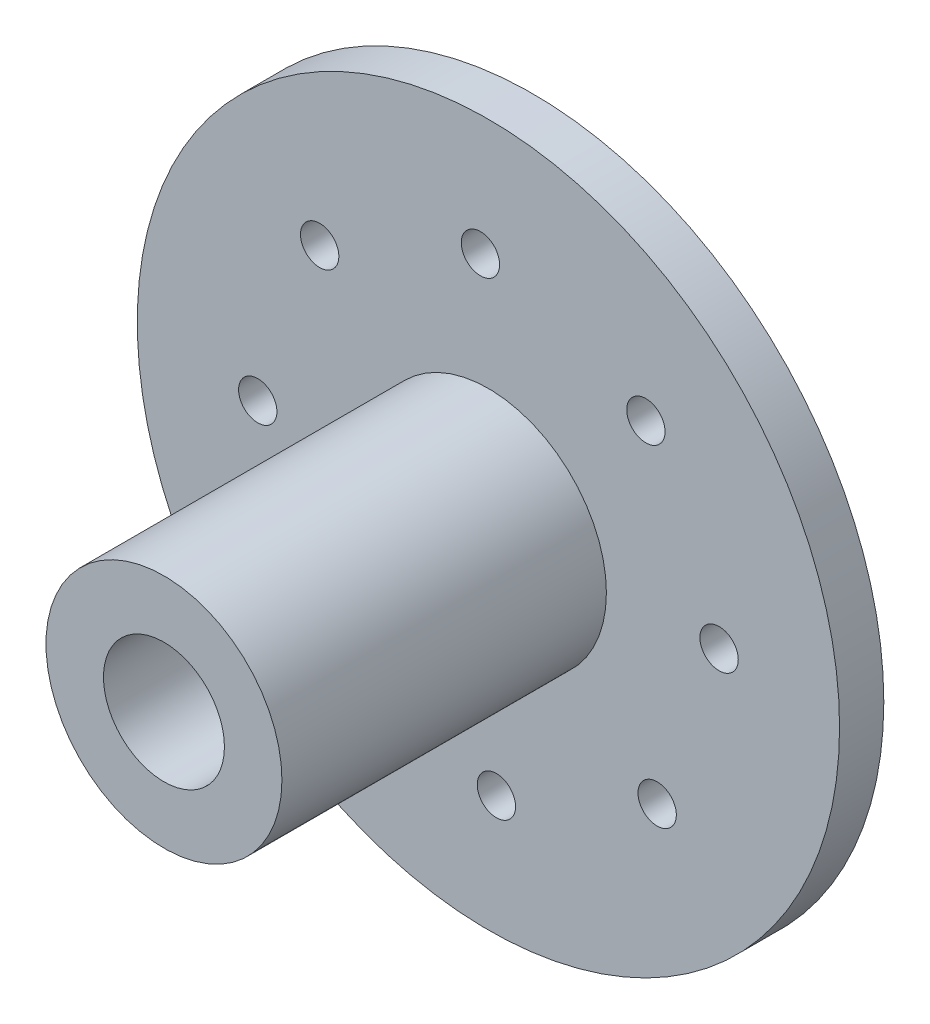
ISO-10303-21;
HEADER;
FILE_DESCRIPTION(('STEP AP214'),'2;1');
FILE_NAME('part.step','',(''),(''),'','','');
FILE_SCHEMA(('AUTOMOTIVE_DESIGN { 1 0 10303 214 1 1 1 1 }'));
ENDSEC;
DATA;
#1=APPLICATION_CONTEXT('core data for automotive mechanical design processes');
#2=APPLICATION_PROTOCOL_DEFINITION('international standard','automotive_design',2000,#1);
#3=PRODUCT_CONTEXT('',#1,'mechanical');
#4=PRODUCT('Part','Part','',(#3));
#5=PRODUCT_RELATED_PRODUCT_CATEGORY('part','',(#4));
#6=PRODUCT_DEFINITION_FORMATION('','',#4);
#7=PRODUCT_DEFINITION_CONTEXT('part definition',#1,'design');
#8=PRODUCT_DEFINITION('design','',#6,#7);
#9=PRODUCT_DEFINITION_SHAPE('','',#8);
#10=(LENGTH_UNIT() NAMED_UNIT(*) SI_UNIT(.MILLI.,.METRE.));
#11=(NAMED_UNIT(*) PLANE_ANGLE_UNIT() SI_UNIT($,.RADIAN.));
#12=(NAMED_UNIT(*) SI_UNIT($,.STERADIAN.) SOLID_ANGLE_UNIT());
#13=UNCERTAINTY_MEASURE_WITH_UNIT(LENGTH_MEASURE(1.E-05),#10,'distance_accuracy_value','');
#14=(GEOMETRIC_REPRESENTATION_CONTEXT(3) GLOBAL_UNCERTAINTY_ASSIGNED_CONTEXT((#13)) GLOBAL_UNIT_ASSIGNED_CONTEXT((#10,
#11,#12)) REPRESENTATION_CONTEXT('',''));
#15=CARTESIAN_POINT('',(0.,0.,0.));
#16=DIRECTION('',(0.,0.,1.));
#17=DIRECTION('',(1.,0.,0.));
#18=AXIS2_PLACEMENT_3D('',#15,#16,#17);
#19=CARTESIAN_POINT('',(0.,0.,10.));
#20=DIRECTION('',(0.,0.,-1.));
#21=DIRECTION('',(-1.,0.,0.));
#22=AXIS2_PLACEMENT_3D('',#19,#20,#21);
#23=CYLINDRICAL_SURFACE('',#22,0.4);
#24=CARTESIAN_POINT('',(0.,0.,6.5));
#25=DIRECTION('',(0.,0.,1.));
#26=DIRECTION('',(1.,0.,0.));
#27=AXIS2_PLACEMENT_3D('',#24,#25,#26);
#28=CIRCLE('',#27,0.4);
#29=CARTESIAN_POINT('',(0.4,0.,6.5));
#30=VERTEX_POINT('',#29);
#31=EDGE_CURVE('E99',#30,#30,#28,.T.);
#32=ORIENTED_EDGE('',*,*,#31,.T.);
#33=EDGE_LOOP('',(#32));
#34=FACE_BOUND('',#33,.T.);
#35=CARTESIAN_POINT('',(0.,0.,0.999999999999999));
#36=DIRECTION('',(0.,0.,-1.));
#37=DIRECTION('',(-1.,0.,0.));
#38=AXIS2_PLACEMENT_3D('',#35,#36,#37);
#39=CIRCLE('',#38,0.4);
#40=CARTESIAN_POINT('',(-0.4,0.,0.999999999999999));
#41=VERTEX_POINT('',#40);
#42=EDGE_CURVE('E47',#41,#41,#39,.F.);
#43=ORIENTED_EDGE('',*,*,#42,.F.);
#44=EDGE_LOOP('',(#43));
#45=FACE_BOUND('',#44,.T.);
#46=ADVANCED_FACE('F43',(#34,#45),#23,.F.);
#47=CARTESIAN_POINT('',(0.,0.,3.));
#48=DIRECTION('',(0.,0.,-1.));
#49=DIRECTION('',(-1.,0.,0.));
#50=AXIS2_PLACEMENT_3D('',#47,#48,#49);
#51=CYLINDRICAL_SURFACE('',#50,23.81);
#52=CARTESIAN_POINT('',(0.,0.,3.));
#53=DIRECTION('',(0.,0.,1.));
#54=DIRECTION('',(1.,0.,0.));
#55=AXIS2_PLACEMENT_3D('',#52,#53,#54);
#56=CIRCLE('',#55,23.81);
#57=CARTESIAN_POINT('',(23.81,0.,3.));
#58=VERTEX_POINT('',#57);
#59=EDGE_CURVE('E52',#58,#58,#56,.T.);
#60=ORIENTED_EDGE('',*,*,#59,.F.);
#61=EDGE_LOOP('',(#60));
#62=FACE_BOUND('',#61,.T.);
#63=CARTESIAN_POINT('',(0.,0.,0.));
#64=DIRECTION('',(0.,0.,1.));
#65=DIRECTION('',(1.,0.,0.));
#66=AXIS2_PLACEMENT_3D('',#63,#64,#65);
#67=CIRCLE('',#66,23.81);
#68=CARTESIAN_POINT('',(23.81,0.,0.));
#69=VERTEX_POINT('',#68);
#70=EDGE_CURVE('E58',#69,#69,#67,.T.);
#71=ORIENTED_EDGE('',*,*,#70,.T.);
#72=EDGE_LOOP('',(#71));
#73=FACE_BOUND('',#72,.T.);
#74=ADVANCED_FACE('F45',(#62,#73),#51,.T.);
#75=CARTESIAN_POINT('',(0.,0.,3.));
#76=DIRECTION('',(0.,0.,1.));
#77=DIRECTION('',(1.,0.,0.));
#78=AXIS2_PLACEMENT_3D('',#75,#76,#77);
#79=PLANE('',#78);
#80=CARTESIAN_POINT('',(-0.540954740765855,15.6406479395338,3.));
#81=DIRECTION('',(0.,0.,1.));
#82=DIRECTION('',(1.,0.,0.));
#83=AXIS2_PLACEMENT_3D('',#80,#81,#82);
#84=CIRCLE('',#83,1.3);
#85=CARTESIAN_POINT('',(0.759045259234146,15.6406479395338,3.));
#86=VERTEX_POINT('',#85);
#87=EDGE_CURVE('E140',#86,#86,#84,.T.);
#88=ORIENTED_EDGE('',*,*,#87,.F.);
#89=EDGE_LOOP('',(#88));
#90=FACE_BOUND('',#89,.T.);
#91=CARTESIAN_POINT('',(10.6770954546852,11.4421209857063,3.));
#92=DIRECTION('',(0.,0.,1.));
#93=DIRECTION('',(1.,0.,0.));
#94=AXIS2_PLACEMENT_3D('',#91,#92,#93);
#95=CIRCLE('',#94,1.3);
#96=CARTESIAN_POINT('',(11.9770954546852,11.4421209857063,3.));
#97=VERTEX_POINT('',#96);
#98=EDGE_CURVE('E144',#97,#97,#95,.T.);
#99=ORIENTED_EDGE('',*,*,#98,.F.);
#100=EDGE_LOOP('',(#99));
#101=FACE_BOUND('',#100,.T.);
#102=CARTESIAN_POINT('',(15.6406479395338,0.540954740765799,3.));
#103=DIRECTION('',(0.,0.,1.));
#104=DIRECTION('',(1.,0.,0.));
#105=AXIS2_PLACEMENT_3D('',#102,#103,#104);
#106=CIRCLE('',#105,1.3);
#107=CARTESIAN_POINT('',(16.9406479395338,0.540954740765799,3.));
#108=VERTEX_POINT('',#107);
#109=EDGE_CURVE('E148',#108,#108,#106,.T.);
#110=ORIENTED_EDGE('',*,*,#109,.F.);
#111=EDGE_LOOP('',(#110));
#112=FACE_BOUND('',#111,.T.);
#113=CARTESIAN_POINT('',(11.4421209857062,-10.6770954546853,3.));
#114=DIRECTION('',(0.,0.,1.));
#115=DIRECTION('',(1.,0.,0.));
#116=AXIS2_PLACEMENT_3D('',#113,#114,#115);
#117=CIRCLE('',#116,1.3);
#118=CARTESIAN_POINT('',(12.7421209857062,-10.6770954546853,3.));
#119=VERTEX_POINT('',#118);
#120=EDGE_CURVE('E132',#119,#119,#117,.T.);
#121=ORIENTED_EDGE('',*,*,#120,.F.);
#122=EDGE_LOOP('',(#121));
#123=FACE_BOUND('',#122,.T.);
#124=CARTESIAN_POINT('',(0.540954740765749,-15.6406479395338,3.));
#125=DIRECTION('',(0.,0.,1.));
#126=DIRECTION('',(1.,0.,0.));
#127=AXIS2_PLACEMENT_3D('',#124,#125,#126);
#128=CIRCLE('',#127,1.3);
#129=CARTESIAN_POINT('',(1.84095474076575,-15.6406479395338,3.));
#130=VERTEX_POINT('',#129);
#131=EDGE_CURVE('E128',#130,#130,#128,.T.);
#132=ORIENTED_EDGE('',*,*,#131,.F.);
#133=EDGE_LOOP('',(#132));
#134=FACE_BOUND('',#133,.T.);
#135=CARTESIAN_POINT('',(-10.6770954546853,-11.4421209857062,3.));
#136=DIRECTION('',(0.,0.,1.));
#137=DIRECTION('',(1.,0.,0.));
#138=AXIS2_PLACEMENT_3D('',#135,#136,#137);
#139=CIRCLE('',#138,1.3);
#140=CARTESIAN_POINT('',(-9.37709545468531,-11.4421209857062,3.));
#141=VERTEX_POINT('',#140);
#142=EDGE_CURVE('E133',#141,#141,#139,.T.);
#143=ORIENTED_EDGE('',*,*,#142,.F.);
#144=EDGE_LOOP('',(#143));
#145=FACE_BOUND('',#144,.T.);
#146=CARTESIAN_POINT('',(-15.6406479395338,-0.540954740765689,3.));
#147=DIRECTION('',(0.,0.,1.));
#148=DIRECTION('',(1.,0.,0.));
#149=AXIS2_PLACEMENT_3D('',#146,#147,#148);
#150=CIRCLE('',#149,1.3);
#151=CARTESIAN_POINT('',(-14.3406479395338,-0.540954740765689,3.));
#152=VERTEX_POINT('',#151);
#153=EDGE_CURVE('E126',#152,#152,#150,.T.);
#154=ORIENTED_EDGE('',*,*,#153,.F.);
#155=EDGE_LOOP('',(#154));
#156=FACE_BOUND('',#155,.T.);
#157=CARTESIAN_POINT('',(-11.4421209857063,10.6770954546852,3.));
#158=DIRECTION('',(0.,0.,1.));
#159=DIRECTION('',(1.,0.,0.));
#160=AXIS2_PLACEMENT_3D('',#157,#158,#159);
#161=CIRCLE('',#160,1.3);
#162=CARTESIAN_POINT('',(-10.1421209857063,10.6770954546852,3.));
#163=VERTEX_POINT('',#162);
#164=EDGE_CURVE('E72',#163,#163,#161,.T.);
#165=ORIENTED_EDGE('',*,*,#164,.F.);
#166=EDGE_LOOP('',(#165));
#167=FACE_BOUND('',#166,.T.);
#168=CARTESIAN_POINT('',(0.,0.,3.));
#169=DIRECTION('',(0.,0.,1.));
#170=DIRECTION('',(1.,0.,0.));
#171=AXIS2_PLACEMENT_3D('',#168,#169,#170);
#172=CIRCLE('',#171,8.);
#173=CARTESIAN_POINT('',(8.,0.,3.));
#174=VERTEX_POINT('',#173);
#175=EDGE_CURVE('E10',#174,#174,#172,.T.);
#176=ORIENTED_EDGE('',*,*,#175,.F.);
#177=EDGE_LOOP('',(#176));
#178=FACE_BOUND('',#177,.T.);
#179=ORIENTED_EDGE('',*,*,#59,.T.);
#180=EDGE_LOOP('',(#179));
#181=FACE_BOUND('',#180,.T.);
#182=ADVANCED_FACE('F161',(#90,#101,#112,#123,#134,#145,#156,#167,#178,#181),#79,.T.);
#183=CARTESIAN_POINT('',(0.,0.,0.));
#184=DIRECTION('',(0.,0.,1.));
#185=DIRECTION('',(1.,0.,0.));
#186=AXIS2_PLACEMENT_3D('',#183,#184,#185);
#187=PLANE('',#186);
#188=CARTESIAN_POINT('',(0.,0.,0.));
#189=DIRECTION('',(0.,0.,-1.));
#190=DIRECTION('',(-1.,0.,0.));
#191=AXIS2_PLACEMENT_3D('',#188,#189,#190);
#192=CIRCLE('',#191,4.1);
#193=CARTESIAN_POINT('',(-4.1,0.,0.));
#194=VERTEX_POINT('',#193);
#195=EDGE_CURVE('E116',#194,#194,#192,.T.);
#196=ORIENTED_EDGE('',*,*,#195,.F.);
#197=EDGE_LOOP('',(#196));
#198=FACE_BOUND('',#197,.T.);
#199=CARTESIAN_POINT('',(-0.540954740765855,15.6406479395338,0.));
#200=DIRECTION('',(0.,0.,1.));
#201=DIRECTION('',(1.,0.,0.));
#202=AXIS2_PLACEMENT_3D('',#199,#200,#201);
#203=CIRCLE('',#202,1.3);
#204=CARTESIAN_POINT('',(0.759045259234146,15.6406479395338,0.));
#205=VERTEX_POINT('',#204);
#206=EDGE_CURVE('E96',#205,#205,#203,.T.);
#207=ORIENTED_EDGE('',*,*,#206,.T.);
#208=EDGE_LOOP('',(#207));
#209=FACE_BOUND('',#208,.T.);
#210=CARTESIAN_POINT('',(10.6770954546852,11.4421209857063,0.));
#211=DIRECTION('',(0.,0.,1.));
#212=DIRECTION('',(1.,0.,0.));
#213=AXIS2_PLACEMENT_3D('',#210,#211,#212);
#214=CIRCLE('',#213,1.3);
#215=CARTESIAN_POINT('',(11.9770954546852,11.4421209857063,0.));
#216=VERTEX_POINT('',#215);
#217=EDGE_CURVE('E92',#216,#216,#214,.T.);
#218=ORIENTED_EDGE('',*,*,#217,.T.);
#219=EDGE_LOOP('',(#218));
#220=FACE_BOUND('',#219,.T.);
#221=CARTESIAN_POINT('',(15.6406479395338,0.540954740765799,0.));
#222=DIRECTION('',(0.,0.,1.));
#223=DIRECTION('',(1.,0.,0.));
#224=AXIS2_PLACEMENT_3D('',#221,#222,#223);
#225=CIRCLE('',#224,1.3);
#226=CARTESIAN_POINT('',(16.9406479395338,0.540954740765799,0.));
#227=VERTEX_POINT('',#226);
#228=EDGE_CURVE('E88',#227,#227,#225,.T.);
#229=ORIENTED_EDGE('',*,*,#228,.T.);
#230=EDGE_LOOP('',(#229));
#231=FACE_BOUND('',#230,.T.);
#232=CARTESIAN_POINT('',(11.4421209857062,-10.6770954546853,0.));
#233=DIRECTION('',(0.,0.,1.));
#234=DIRECTION('',(1.,0.,0.));
#235=AXIS2_PLACEMENT_3D('',#232,#233,#234);
#236=CIRCLE('',#235,1.3);
#237=CARTESIAN_POINT('',(12.7421209857062,-10.6770954546853,0.));
#238=VERTEX_POINT('',#237);
#239=EDGE_CURVE('E84',#238,#238,#236,.T.);
#240=ORIENTED_EDGE('',*,*,#239,.T.);
#241=EDGE_LOOP('',(#240));
#242=FACE_BOUND('',#241,.T.);
#243=CARTESIAN_POINT('',(0.540954740765749,-15.6406479395338,0.));
#244=DIRECTION('',(0.,0.,1.));
#245=DIRECTION('',(1.,0.,0.));
#246=AXIS2_PLACEMENT_3D('',#243,#244,#245);
#247=CIRCLE('',#246,1.3);
#248=CARTESIAN_POINT('',(1.84095474076575,-15.6406479395338,0.));
#249=VERTEX_POINT('',#248);
#250=EDGE_CURVE('E80',#249,#249,#247,.T.);
#251=ORIENTED_EDGE('',*,*,#250,.T.);
#252=EDGE_LOOP('',(#251));
#253=FACE_BOUND('',#252,.T.);
#254=CARTESIAN_POINT('',(-10.6770954546853,-11.4421209857062,0.));
#255=DIRECTION('',(0.,0.,1.));
#256=DIRECTION('',(1.,0.,0.));
#257=AXIS2_PLACEMENT_3D('',#254,#255,#256);
#258=CIRCLE('',#257,1.3);
#259=CARTESIAN_POINT('',(-9.37709545468531,-11.4421209857062,0.));
#260=VERTEX_POINT('',#259);
#261=EDGE_CURVE('E76',#260,#260,#258,.T.);
#262=ORIENTED_EDGE('',*,*,#261,.T.);
#263=EDGE_LOOP('',(#262));
#264=FACE_BOUND('',#263,.T.);
#265=CARTESIAN_POINT('',(-15.6406479395338,-0.540954740765689,0.));
#266=DIRECTION('',(0.,0.,1.));
#267=DIRECTION('',(1.,0.,0.));
#268=AXIS2_PLACEMENT_3D('',#265,#266,#267);
#269=CIRCLE('',#268,1.3);
#270=CARTESIAN_POINT('',(-14.3406479395338,-0.540954740765689,0.));
#271=VERTEX_POINT('',#270);
#272=EDGE_CURVE('E71',#271,#271,#269,.T.);
#273=ORIENTED_EDGE('',*,*,#272,.T.);
#274=EDGE_LOOP('',(#273));
#275=FACE_BOUND('',#274,.T.);
#276=CARTESIAN_POINT('',(-11.4421209857063,10.6770954546852,0.));
#277=DIRECTION('',(0.,0.,1.));
#278=DIRECTION('',(1.,0.,0.));
#279=AXIS2_PLACEMENT_3D('',#276,#277,#278);
#280=CIRCLE('',#279,1.3);
#281=CARTESIAN_POINT('',(-10.1421209857063,10.6770954546852,0.));
#282=VERTEX_POINT('',#281);
#283=EDGE_CURVE('E67',#282,#282,#280,.T.);
#284=ORIENTED_EDGE('',*,*,#283,.T.);
#285=EDGE_LOOP('',(#284));
#286=FACE_BOUND('',#285,.T.);
#287=ORIENTED_EDGE('',*,*,#70,.F.);
#288=EDGE_LOOP('',(#287));
#289=FACE_BOUND('',#288,.T.);
#290=ADVANCED_FACE('F164',(#198,#209,#220,#231,#242,#253,#264,#275,#286,#289),#187,.F.);
#291=CARTESIAN_POINT('',(0.,0.,25.));
#292=DIRECTION('',(0.,0.,-1.));
#293=DIRECTION('',(-1.,0.,0.));
#294=AXIS2_PLACEMENT_3D('',#291,#292,#293);
#295=CYLINDRICAL_SURFACE('',#294,8.);
#296=CARTESIAN_POINT('',(0.,0.,25.));
#297=DIRECTION('',(0.,0.,1.));
#298=DIRECTION('',(1.,0.,0.));
#299=AXIS2_PLACEMENT_3D('',#296,#297,#298);
#300=CIRCLE('',#299,8.);
#301=CARTESIAN_POINT('',(8.,0.,25.));
#302=VERTEX_POINT('',#301);
#303=EDGE_CURVE('E61',#302,#302,#300,.T.);
#304=ORIENTED_EDGE('',*,*,#303,.F.);
#305=EDGE_LOOP('',(#304));
#306=FACE_BOUND('',#305,.T.);
#307=ORIENTED_EDGE('',*,*,#175,.T.);
#308=EDGE_LOOP('',(#307));
#309=FACE_BOUND('',#308,.T.);
#310=ADVANCED_FACE('F175',(#306,#309),#295,.T.);
#311=CARTESIAN_POINT('',(0.,0.,25.));
#312=DIRECTION('',(0.,0.,1.));
#313=DIRECTION('',(1.,0.,0.));
#314=AXIS2_PLACEMENT_3D('',#311,#312,#313);
#315=PLANE('',#314);
#316=CARTESIAN_POINT('',(0.,0.,25.));
#317=DIRECTION('',(0.,0.,1.));
#318=DIRECTION('',(1.,0.,0.));
#319=AXIS2_PLACEMENT_3D('',#316,#317,#318);
#320=CIRCLE('',#319,4.1);
#321=CARTESIAN_POINT('',(4.1,0.,25.));
#322=VERTEX_POINT('',#321);
#323=EDGE_CURVE('E102',#322,#322,#320,.T.);
#324=ORIENTED_EDGE('',*,*,#323,.F.);
#325=EDGE_LOOP('',(#324));
#326=FACE_BOUND('',#325,.T.);
#327=ORIENTED_EDGE('',*,*,#303,.T.);
#328=EDGE_LOOP('',(#327));
#329=FACE_BOUND('',#328,.T.);
#330=ADVANCED_FACE('F182',(#326,#329),#315,.T.);
#331=CARTESIAN_POINT('',(-11.4421209857063,10.6770954546852,-21.));
#332=DIRECTION('',(0.,0.,1.));
#333=DIRECTION('',(1.,0.,0.));
#334=AXIS2_PLACEMENT_3D('',#331,#332,#333);
#335=CYLINDRICAL_SURFACE('',#334,1.3);
#336=ORIENTED_EDGE('',*,*,#164,.T.);
#337=EDGE_LOOP('',(#336));
#338=FACE_BOUND('',#337,.T.);
#339=ORIENTED_EDGE('',*,*,#283,.F.);
#340=EDGE_LOOP('',(#339));
#341=FACE_BOUND('',#340,.T.);
#342=ADVANCED_FACE('F158',(#338,#341),#335,.F.);
#343=CARTESIAN_POINT('',(-15.6406479395338,-0.540954740765689,-21.));
#344=DIRECTION('',(0.,0.,1.));
#345=DIRECTION('',(1.,0.,0.));
#346=AXIS2_PLACEMENT_3D('',#343,#344,#345);
#347=CYLINDRICAL_SURFACE('',#346,1.3);
#348=ORIENTED_EDGE('',*,*,#153,.T.);
#349=EDGE_LOOP('',(#348));
#350=FACE_BOUND('',#349,.T.);
#351=ORIENTED_EDGE('',*,*,#272,.F.);
#352=EDGE_LOOP('',(#351));
#353=FACE_BOUND('',#352,.T.);
#354=ADVANCED_FACE('F213',(#350,#353),#347,.F.);
#355=CARTESIAN_POINT('',(-10.6770954546853,-11.4421209857062,-21.));
#356=DIRECTION('',(0.,0.,1.));
#357=DIRECTION('',(1.,0.,0.));
#358=AXIS2_PLACEMENT_3D('',#355,#356,#357);
#359=CYLINDRICAL_SURFACE('',#358,1.3);
#360=ORIENTED_EDGE('',*,*,#142,.T.);
#361=EDGE_LOOP('',(#360));
#362=FACE_BOUND('',#361,.T.);
#363=ORIENTED_EDGE('',*,*,#261,.F.);
#364=EDGE_LOOP('',(#363));
#365=FACE_BOUND('',#364,.T.);
#366=ADVANCED_FACE('F209',(#362,#365),#359,.F.);
#367=CARTESIAN_POINT('',(0.540954740765749,-15.6406479395338,-21.));
#368=DIRECTION('',(0.,0.,1.));
#369=DIRECTION('',(1.,0.,0.));
#370=AXIS2_PLACEMENT_3D('',#367,#368,#369);
#371=CYLINDRICAL_SURFACE('',#370,1.3);
#372=ORIENTED_EDGE('',*,*,#131,.T.);
#373=EDGE_LOOP('',(#372));
#374=FACE_BOUND('',#373,.T.);
#375=ORIENTED_EDGE('',*,*,#250,.F.);
#376=EDGE_LOOP('',(#375));
#377=FACE_BOUND('',#376,.T.);
#378=ADVANCED_FACE('F205',(#374,#377),#371,.F.);
#379=CARTESIAN_POINT('',(11.4421209857062,-10.6770954546853,-21.));
#380=DIRECTION('',(0.,0.,1.));
#381=DIRECTION('',(1.,0.,0.));
#382=AXIS2_PLACEMENT_3D('',#379,#380,#381);
#383=CYLINDRICAL_SURFACE('',#382,1.3);
#384=ORIENTED_EDGE('',*,*,#120,.T.);
#385=EDGE_LOOP('',(#384));
#386=FACE_BOUND('',#385,.T.);
#387=ORIENTED_EDGE('',*,*,#239,.F.);
#388=EDGE_LOOP('',(#387));
#389=FACE_BOUND('',#388,.T.);
#390=ADVANCED_FACE('F208',(#386,#389),#383,.F.);
#391=CARTESIAN_POINT('',(15.6406479395338,0.540954740765799,-21.));
#392=DIRECTION('',(0.,0.,1.));
#393=DIRECTION('',(1.,0.,0.));
#394=AXIS2_PLACEMENT_3D('',#391,#392,#393);
#395=CYLINDRICAL_SURFACE('',#394,1.3);
#396=ORIENTED_EDGE('',*,*,#109,.T.);
#397=EDGE_LOOP('',(#396));
#398=FACE_BOUND('',#397,.T.);
#399=ORIENTED_EDGE('',*,*,#228,.F.);
#400=EDGE_LOOP('',(#399));
#401=FACE_BOUND('',#400,.T.);
#402=ADVANCED_FACE('F224',(#398,#401),#395,.F.);
#403=CARTESIAN_POINT('',(10.6770954546852,11.4421209857063,-21.));
#404=DIRECTION('',(0.,0.,1.));
#405=DIRECTION('',(1.,0.,0.));
#406=AXIS2_PLACEMENT_3D('',#403,#404,#405);
#407=CYLINDRICAL_SURFACE('',#406,1.3);
#408=ORIENTED_EDGE('',*,*,#98,.T.);
#409=EDGE_LOOP('',(#408));
#410=FACE_BOUND('',#409,.T.);
#411=ORIENTED_EDGE('',*,*,#217,.F.);
#412=EDGE_LOOP('',(#411));
#413=FACE_BOUND('',#412,.T.);
#414=ADVANCED_FACE('F220',(#410,#413),#407,.F.);
#415=CARTESIAN_POINT('',(-0.540954740765855,15.6406479395338,-21.));
#416=DIRECTION('',(0.,0.,1.));
#417=DIRECTION('',(1.,0.,0.));
#418=AXIS2_PLACEMENT_3D('',#415,#416,#417);
#419=CYLINDRICAL_SURFACE('',#418,1.3);
#420=ORIENTED_EDGE('',*,*,#87,.T.);
#421=EDGE_LOOP('',(#420));
#422=FACE_BOUND('',#421,.T.);
#423=ORIENTED_EDGE('',*,*,#206,.F.);
#424=EDGE_LOOP('',(#423));
#425=FACE_BOUND('',#424,.T.);
#426=ADVANCED_FACE('F203',(#422,#425),#419,.F.);
#427=CARTESIAN_POINT('',(0.,0.,6.5));
#428=DIRECTION('',(0.,0.,1.));
#429=DIRECTION('',(1.,0.,0.));
#430=AXIS2_PLACEMENT_3D('',#427,#428,#429);
#431=CYLINDRICAL_SURFACE('',#430,4.1);
#432=CARTESIAN_POINT('',(0.,0.,6.5));
#433=DIRECTION('',(0.,0.,1.));
#434=DIRECTION('',(1.,0.,0.));
#435=AXIS2_PLACEMENT_3D('',#432,#433,#434);
#436=CIRCLE('',#435,4.1);
#437=CARTESIAN_POINT('',(4.1,0.,6.5));
#438=VERTEX_POINT('',#437);
#439=EDGE_CURVE('E108',#438,#438,#436,.T.);
#440=ORIENTED_EDGE('',*,*,#439,.F.);
#441=EDGE_LOOP('',(#440));
#442=FACE_BOUND('',#441,.T.);
#443=ORIENTED_EDGE('',*,*,#323,.T.);
#444=EDGE_LOOP('',(#443));
#445=FACE_BOUND('',#444,.T.);
#446=ADVANCED_FACE('F199',(#442,#445),#431,.F.);
#447=CARTESIAN_POINT('',(0.,0.,6.5));
#448=DIRECTION('',(0.,0.,1.));
#449=DIRECTION('',(1.,0.,0.));
#450=AXIS2_PLACEMENT_3D('',#447,#448,#449);
#451=PLANE('',#450);
#452=ORIENTED_EDGE('',*,*,#31,.F.);
#453=EDGE_LOOP('',(#452));
#454=FACE_BOUND('',#453,.T.);
#455=ORIENTED_EDGE('',*,*,#439,.T.);
#456=EDGE_LOOP('',(#455));
#457=FACE_BOUND('',#456,.T.);
#458=ADVANCED_FACE('F196',(#454,#457),#451,.T.);
#459=CARTESIAN_POINT('',(0.,0.,1.));
#460=DIRECTION('',(0.,0.,-1.));
#461=DIRECTION('',(-1.,0.,0.));
#462=AXIS2_PLACEMENT_3D('',#459,#460,#461);
#463=PLANE('',#462);
#464=CARTESIAN_POINT('',(0.,0.,1.));
#465=DIRECTION('',(0.,0.,-1.));
#466=DIRECTION('',(-1.,0.,0.));
#467=AXIS2_PLACEMENT_3D('',#464,#465,#466);
#468=CIRCLE('',#467,4.1);
#469=CARTESIAN_POINT('',(-4.1,0.,1.));
#470=VERTEX_POINT('',#469);
#471=EDGE_CURVE('E111',#470,#470,#468,.T.);
#472=ORIENTED_EDGE('',*,*,#471,.T.);
#473=EDGE_LOOP('',(#472));
#474=FACE_BOUND('',#473,.T.);
#475=ORIENTED_EDGE('',*,*,#42,.T.);
#476=EDGE_LOOP('',(#475));
#477=FACE_BOUND('',#476,.T.);
#478=ADVANCED_FACE('F198',(#474,#477),#463,.T.);
#479=CARTESIAN_POINT('',(0.,0.,1.));
#480=DIRECTION('',(0.,0.,-1.));
#481=DIRECTION('',(-1.,0.,0.));
#482=AXIS2_PLACEMENT_3D('',#479,#480,#481);
#483=CYLINDRICAL_SURFACE('',#482,4.1);
#484=ORIENTED_EDGE('',*,*,#471,.F.);
#485=EDGE_LOOP('',(#484));
#486=FACE_BOUND('',#485,.T.);
#487=ORIENTED_EDGE('',*,*,#195,.T.);
#488=EDGE_LOOP('',(#487));
#489=FACE_BOUND('',#488,.T.);
#490=ADVANCED_FACE('F194',(#486,#489),#483,.F.);
#491=CLOSED_SHELL('',(#46,#74,#182,#290,#310,#330,#342,#354,#366,#378,#390,#402,#414,#426,#446,
#458,#478,#490));
#492=MANIFOLD_SOLID_BREP('B2',#491);
#493=ADVANCED_BREP_SHAPE_REPRESENTATION('',(#18,#492),#14);
#494=SHAPE_DEFINITION_REPRESENTATION(#9,#493);
ENDSEC;
END-ISO-10303-21;
